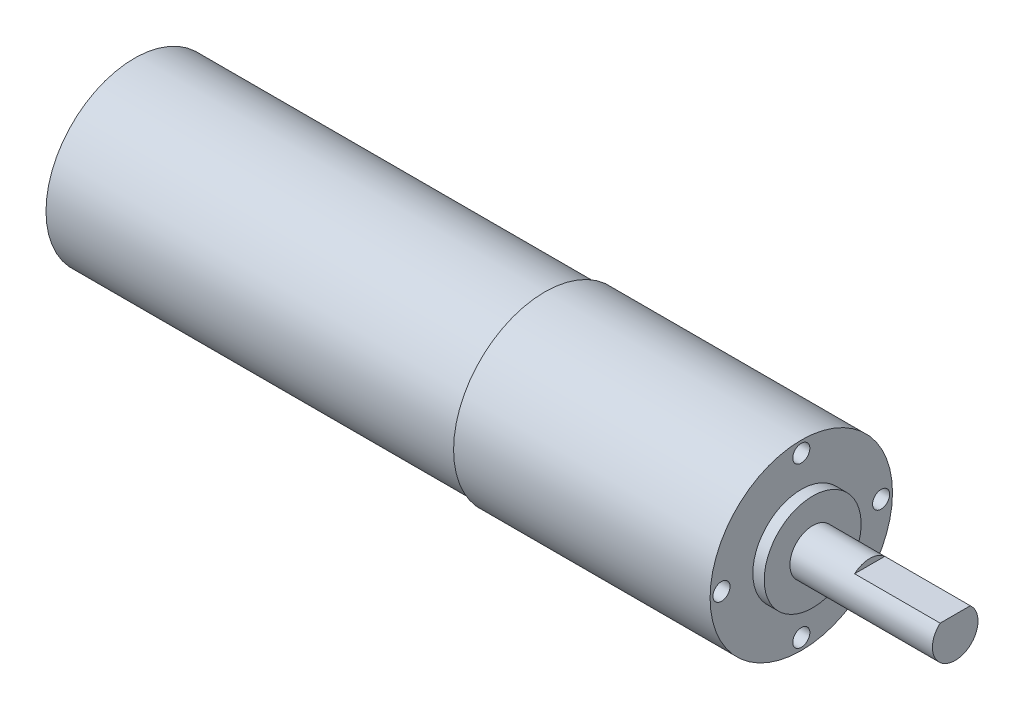
ISO-10303-21;
HEADER;
FILE_DESCRIPTION(('STEP AP214'),'2;1');
FILE_NAME('part.step','',(''),(''),'','','');
FILE_SCHEMA(('AUTOMOTIVE_DESIGN { 1 0 10303 214 1 1 1 1 }'));
ENDSEC;
DATA;
#1=APPLICATION_CONTEXT('core data for automotive mechanical design processes');
#2=APPLICATION_PROTOCOL_DEFINITION('international standard','automotive_design',2000,#1);
#3=PRODUCT_CONTEXT('',#1,'mechanical');
#4=PRODUCT('Part','Part','',(#3));
#5=PRODUCT_RELATED_PRODUCT_CATEGORY('part','',(#4));
#6=PRODUCT_DEFINITION_FORMATION('','',#4);
#7=PRODUCT_DEFINITION_CONTEXT('part definition',#1,'design');
#8=PRODUCT_DEFINITION('design','',#6,#7);
#9=PRODUCT_DEFINITION_SHAPE('','',#8);
#10=(LENGTH_UNIT() NAMED_UNIT(*) SI_UNIT(.MILLI.,.METRE.));
#11=(NAMED_UNIT(*) PLANE_ANGLE_UNIT() SI_UNIT($,.RADIAN.));
#12=(NAMED_UNIT(*) SI_UNIT($,.STERADIAN.) SOLID_ANGLE_UNIT());
#13=UNCERTAINTY_MEASURE_WITH_UNIT(LENGTH_MEASURE(1.E-05),#10,'distance_accuracy_value','');
#14=(GEOMETRIC_REPRESENTATION_CONTEXT(3) GLOBAL_UNCERTAINTY_ASSIGNED_CONTEXT((#13)) GLOBAL_UNIT_ASSIGNED_CONTEXT((#10,
#11,#12)) REPRESENTATION_CONTEXT('',''));
#15=CARTESIAN_POINT('',(0.,0.,0.));
#16=DIRECTION('',(0.,0.,1.));
#17=DIRECTION('',(1.,0.,0.));
#18=AXIS2_PLACEMENT_3D('',#15,#16,#17);
#19=CARTESIAN_POINT('',(0.,0.,0.));
#20=DIRECTION('',(1.,0.,0.));
#21=DIRECTION('',(0.,0.,-1.));
#22=AXIS2_PLACEMENT_3D('',#19,#20,#21);
#23=PLANE('',#22);
#24=CARTESIAN_POINT('',(0.,0.,0.));
#25=DIRECTION('',(-1.,0.,0.));
#26=DIRECTION('',(0.,0.,1.));
#27=AXIS2_PLACEMENT_3D('',#24,#25,#26);
#28=CIRCLE('',#27,15.5);
#29=CARTESIAN_POINT('',(0.,0.,15.5));
#30=VERTEX_POINT('',#29);
#31=EDGE_CURVE('E11',#30,#30,#28,.T.);
#32=ORIENTED_EDGE('',*,*,#31,.T.);
#33=EDGE_LOOP('',(#32));
#34=FACE_BOUND('',#33,.T.);
#35=ADVANCED_FACE('F36',(#34),#23,.F.);
#36=CARTESIAN_POINT('',(0.,0.,0.));
#37=DIRECTION('',(-1.,0.,0.));
#38=DIRECTION('',(0.,0.,1.));
#39=AXIS2_PLACEMENT_3D('',#36,#37,#38);
#40=CYLINDRICAL_SURFACE('',#39,15.5);
#41=ORIENTED_EDGE('',*,*,#31,.F.);
#42=EDGE_LOOP('',(#41));
#43=FACE_BOUND('',#42,.T.);
#44=CARTESIAN_POINT('',(72.,0.,0.));
#45=DIRECTION('',(-1.,0.,0.));
#46=DIRECTION('',(0.,0.,1.));
#47=AXIS2_PLACEMENT_3D('',#44,#45,#46);
#48=CIRCLE('',#47,15.5);
#49=CARTESIAN_POINT('',(72.,0.,15.5));
#50=VERTEX_POINT('',#49);
#51=EDGE_CURVE('E43',#50,#50,#48,.T.);
#52=ORIENTED_EDGE('',*,*,#51,.T.);
#53=EDGE_LOOP('',(#52));
#54=FACE_BOUND('',#53,.T.);
#55=ADVANCED_FACE('F96',(#43,#54),#40,.T.);
#56=CARTESIAN_POINT('',(72.,15.5,0.));
#57=DIRECTION('',(1.,0.,0.));
#58=DIRECTION('',(0.,0.,-1.));
#59=AXIS2_PLACEMENT_3D('',#56,#57,#58);
#60=PLANE('',#59);
#61=ORIENTED_EDGE('',*,*,#51,.F.);
#62=EDGE_LOOP('',(#61));
#63=FACE_BOUND('',#62,.T.);
#64=CARTESIAN_POINT('',(72.,0.,0.));
#65=DIRECTION('',(-1.,0.,0.));
#66=DIRECTION('',(0.,0.,1.));
#67=AXIS2_PLACEMENT_3D('',#64,#65,#66);
#68=CIRCLE('',#67,16.);
#69=CARTESIAN_POINT('',(72.,0.,16.));
#70=VERTEX_POINT('',#69);
#71=EDGE_CURVE('E91',#70,#70,#68,.T.);
#72=ORIENTED_EDGE('',*,*,#71,.T.);
#73=EDGE_LOOP('',(#72));
#74=FACE_BOUND('',#73,.T.);
#75=ADVANCED_FACE('F98',(#63,#74),#60,.F.);
#76=CARTESIAN_POINT('',(0.,0.,0.));
#77=DIRECTION('',(-1.,0.,0.));
#78=DIRECTION('',(0.,0.,1.));
#79=AXIS2_PLACEMENT_3D('',#76,#77,#78);
#80=CYLINDRICAL_SURFACE('',#79,16.);
#81=ORIENTED_EDGE('',*,*,#71,.F.);
#82=EDGE_LOOP('',(#81));
#83=FACE_BOUND('',#82,.T.);
#84=CARTESIAN_POINT('',(117.,0.,0.));
#85=DIRECTION('',(-1.,0.,0.));
#86=DIRECTION('',(0.,0.,1.));
#87=AXIS2_PLACEMENT_3D('',#84,#85,#86);
#88=CIRCLE('',#87,16.);
#89=CARTESIAN_POINT('',(117.,0.,16.));
#90=VERTEX_POINT('',#89);
#91=EDGE_CURVE('E88',#90,#90,#88,.T.);
#92=ORIENTED_EDGE('',*,*,#91,.T.);
#93=EDGE_LOOP('',(#92));
#94=FACE_BOUND('',#93,.T.);
#95=ADVANCED_FACE('F101',(#83,#94),#80,.T.);
#96=CARTESIAN_POINT('',(117.,16.,0.));
#97=DIRECTION('',(-1.,0.,0.));
#98=DIRECTION('',(0.,0.,1.));
#99=AXIS2_PLACEMENT_3D('',#96,#97,#98);
#100=PLANE('',#99);
#101=CARTESIAN_POINT('',(117.,14.,0.));
#102=DIRECTION('',(1.,0.,0.));
#103=DIRECTION('',(0.,0.,-1.));
#104=AXIS2_PLACEMENT_3D('',#101,#102,#103);
#105=CIRCLE('',#104,1.5);
#106=CARTESIAN_POINT('',(117.,14.,-1.5));
#107=VERTEX_POINT('',#106);
#108=EDGE_CURVE('E277',#107,#107,#105,.T.);
#109=ORIENTED_EDGE('',*,*,#108,.F.);
#110=EDGE_LOOP('',(#109));
#111=FACE_BOUND('',#110,.T.);
#112=CARTESIAN_POINT('',(117.,0.,-14.));
#113=DIRECTION('',(1.,0.,0.));
#114=DIRECTION('',(0.,0.,-1.));
#115=AXIS2_PLACEMENT_3D('',#112,#113,#114);
#116=CIRCLE('',#115,1.50000000000011);
#117=CARTESIAN_POINT('',(117.,0.,-15.5000000000001));
#118=VERTEX_POINT('',#117);
#119=EDGE_CURVE('E285',#118,#118,#116,.T.);
#120=ORIENTED_EDGE('',*,*,#119,.F.);
#121=EDGE_LOOP('',(#120));
#122=FACE_BOUND('',#121,.T.);
#123=CARTESIAN_POINT('',(117.,-14.,0.));
#124=DIRECTION('',(1.,0.,0.));
#125=DIRECTION('',(0.,0.,-1.));
#126=AXIS2_PLACEMENT_3D('',#123,#124,#125);
#127=CIRCLE('',#126,1.50000000000049);
#128=CARTESIAN_POINT('',(117.,-14.,-1.5000000000005));
#129=VERTEX_POINT('',#128);
#130=EDGE_CURVE('E291',#129,#129,#127,.T.);
#131=ORIENTED_EDGE('',*,*,#130,.F.);
#132=EDGE_LOOP('',(#131));
#133=FACE_BOUND('',#132,.T.);
#134=CARTESIAN_POINT('',(117.,0.,14.));
#135=DIRECTION('',(1.,0.,0.));
#136=DIRECTION('',(0.,0.,-1.));
#137=AXIS2_PLACEMENT_3D('',#134,#135,#136);
#138=CIRCLE('',#137,1.50000000000038);
#139=CARTESIAN_POINT('',(117.,0.,12.4999999999996));
#140=VERTEX_POINT('',#139);
#141=EDGE_CURVE('E297',#140,#140,#138,.T.);
#142=ORIENTED_EDGE('',*,*,#141,.F.);
#143=EDGE_LOOP('',(#142));
#144=FACE_BOUND('',#143,.T.);
#145=ORIENTED_EDGE('',*,*,#91,.F.);
#146=EDGE_LOOP('',(#145));
#147=FACE_BOUND('',#146,.T.);
#148=CARTESIAN_POINT('',(117.,0.,0.));
#149=DIRECTION('',(-1.,0.,0.));
#150=DIRECTION('',(0.,0.,1.));
#151=AXIS2_PLACEMENT_3D('',#148,#149,#150);
#152=CIRCLE('',#151,8.5);
#153=CARTESIAN_POINT('',(117.,0.,8.5));
#154=VERTEX_POINT('',#153);
#155=EDGE_CURVE('E85',#154,#154,#152,.T.);
#156=ORIENTED_EDGE('',*,*,#155,.T.);
#157=EDGE_LOOP('',(#156));
#158=FACE_BOUND('',#157,.T.);
#159=ADVANCED_FACE('F107',(#111,#122,#133,#144,#147,#158),#100,.F.);
#160=CARTESIAN_POINT('',(0.,0.,0.));
#161=DIRECTION('',(-1.,0.,0.));
#162=DIRECTION('',(0.,0.,1.));
#163=AXIS2_PLACEMENT_3D('',#160,#161,#162);
#164=CYLINDRICAL_SURFACE('',#163,8.5);
#165=ORIENTED_EDGE('',*,*,#155,.F.);
#166=EDGE_LOOP('',(#165));
#167=FACE_BOUND('',#166,.T.);
#168=CARTESIAN_POINT('',(119.,0.,0.));
#169=DIRECTION('',(-1.,0.,0.));
#170=DIRECTION('',(0.,0.,1.));
#171=AXIS2_PLACEMENT_3D('',#168,#169,#170);
#172=CIRCLE('',#171,8.5);
#173=CARTESIAN_POINT('',(119.,0.,8.5));
#174=VERTEX_POINT('',#173);
#175=EDGE_CURVE('E79',#174,#174,#172,.T.);
#176=ORIENTED_EDGE('',*,*,#175,.T.);
#177=EDGE_LOOP('',(#176));
#178=FACE_BOUND('',#177,.T.);
#179=ADVANCED_FACE('F113',(#167,#178),#164,.T.);
#180=CARTESIAN_POINT('',(119.,8.5,0.));
#181=DIRECTION('',(-1.,0.,0.));
#182=DIRECTION('',(0.,0.,1.));
#183=AXIS2_PLACEMENT_3D('',#180,#181,#182);
#184=PLANE('',#183);
#185=ORIENTED_EDGE('',*,*,#175,.F.);
#186=EDGE_LOOP('',(#185));
#187=FACE_BOUND('',#186,.T.);
#188=CARTESIAN_POINT('',(119.,0.,0.));
#189=DIRECTION('',(-1.,0.,0.));
#190=DIRECTION('',(0.,0.,1.));
#191=AXIS2_PLACEMENT_3D('',#188,#189,#190);
#192=CIRCLE('',#191,4.);
#193=CARTESIAN_POINT('',(119.,0.,4.));
#194=VERTEX_POINT('',#193);
#195=EDGE_CURVE('E76',#194,#194,#192,.T.);
#196=ORIENTED_EDGE('',*,*,#195,.T.);
#197=EDGE_LOOP('',(#196));
#198=FACE_BOUND('',#197,.T.);
#199=ADVANCED_FACE('F120',(#187,#198),#184,.F.);
#200=CARTESIAN_POINT('',(0.,0.,0.));
#201=DIRECTION('',(-1.,0.,0.));
#202=DIRECTION('',(0.,0.,1.));
#203=AXIS2_PLACEMENT_3D('',#200,#201,#202);
#204=CYLINDRICAL_SURFACE('',#203,4.);
#205=CARTESIAN_POINT('',(144.,0.,0.));
#206=DIRECTION('',(-1.,0.,0.));
#207=DIRECTION('',(0.,0.,1.));
#208=AXIS2_PLACEMENT_3D('',#205,#206,#207);
#209=CIRCLE('',#208,4.);
#210=CARTESIAN_POINT('',(144.,3.,-2.64575131106459));
#211=VERTEX_POINT('',#210);
#212=CARTESIAN_POINT('',(144.,3.,2.64575131106459));
#213=VERTEX_POINT('',#212);
#214=EDGE_CURVE('E73',#211,#213,#209,.T.);
#215=ORIENTED_EDGE('',*,*,#214,.T.);
#216=DIRECTION('',(1.,0.,0.));
#217=VECTOR('',#216,1.);
#218=CARTESIAN_POINT('',(129.,3.,2.64575131106459));
#219=LINE('',#218,#217);
#220=CARTESIAN_POINT('',(129.,3.,2.64575131106459));
#221=VERTEX_POINT('',#220);
#222=EDGE_CURVE('E50',#221,#213,#219,.T.);
#223=ORIENTED_EDGE('',*,*,#222,.F.);
#224=CARTESIAN_POINT('',(129.,0.,0.));
#225=DIRECTION('',(1.,0.,0.));
#226=DIRECTION('',(0.,0.,-1.));
#227=AXIS2_PLACEMENT_3D('',#224,#225,#226);
#228=CIRCLE('',#227,4.);
#229=CARTESIAN_POINT('',(129.,3.,-2.64575131106459));
#230=VERTEX_POINT('',#229);
#231=EDGE_CURVE('E66',#230,#221,#228,.T.);
#232=ORIENTED_EDGE('',*,*,#231,.F.);
#233=DIRECTION('',(1.,0.,0.));
#234=VECTOR('',#233,1.);
#235=CARTESIAN_POINT('',(129.,3.,-2.64575131106459));
#236=LINE('',#235,#234);
#237=EDGE_CURVE('E56',#230,#211,#236,.T.);
#238=ORIENTED_EDGE('',*,*,#237,.T.);
#239=EDGE_LOOP('',(#215,#223,#232,#238));
#240=FACE_BOUND('',#239,.T.);
#241=ORIENTED_EDGE('',*,*,#195,.F.);
#242=EDGE_LOOP('',(#241));
#243=FACE_BOUND('',#242,.T.);
#244=ADVANCED_FACE('F71',(#240,#243),#204,.T.);
#245=CARTESIAN_POINT('',(144.,4.,0.));
#246=DIRECTION('',(-1.,0.,0.));
#247=DIRECTION('',(0.,0.,1.));
#248=AXIS2_PLACEMENT_3D('',#245,#246,#247);
#249=PLANE('',#248);
#250=ORIENTED_EDGE('',*,*,#214,.F.);
#251=DIRECTION('',(0.,0.,-1.));
#252=VECTOR('',#251,1.);
#253=CARTESIAN_POINT('',(144.,3.,2.64575131106459));
#254=LINE('',#253,#252);
#255=EDGE_CURVE('E61',#213,#211,#254,.T.);
#256=ORIENTED_EDGE('',*,*,#255,.F.);
#257=EDGE_LOOP('',(#250,#256));
#258=FACE_BOUND('',#257,.T.);
#259=ADVANCED_FACE('F75',(#258),#249,.F.);
#260=CARTESIAN_POINT('',(129.,3.,2.64575131106459));
#261=DIRECTION('',(0.,-1.,0.));
#262=DIRECTION('',(0.,0.,-1.));
#263=AXIS2_PLACEMENT_3D('',#260,#261,#262);
#264=PLANE('',#263);
#265=ORIENTED_EDGE('',*,*,#255,.T.);
#266=ORIENTED_EDGE('',*,*,#237,.F.);
#267=DIRECTION('',(0.,0.,-1.));
#268=VECTOR('',#267,1.);
#269=CARTESIAN_POINT('',(129.,3.,2.64575131106459));
#270=LINE('',#269,#268);
#271=EDGE_CURVE('E301',#221,#230,#270,.T.);
#272=ORIENTED_EDGE('',*,*,#271,.F.);
#273=ORIENTED_EDGE('',*,*,#222,.T.);
#274=EDGE_LOOP('',(#265,#266,#272,#273));
#275=FACE_BOUND('',#274,.T.);
#276=ADVANCED_FACE('F62',(#275),#264,.F.);
#277=CARTESIAN_POINT('',(129.,0.,0.));
#278=DIRECTION('',(1.,0.,0.));
#279=DIRECTION('',(0.,0.,-1.));
#280=AXIS2_PLACEMENT_3D('',#277,#278,#279);
#281=PLANE('',#280);
#282=ORIENTED_EDGE('',*,*,#231,.T.);
#283=ORIENTED_EDGE('',*,*,#271,.T.);
#284=EDGE_LOOP('',(#282,#283));
#285=FACE_BOUND('',#284,.T.);
#286=ADVANCED_FACE('F183',(#285),#281,.T.);
#287=CARTESIAN_POINT('',(112.,0.,14.));
#288=DIRECTION('',(1.,0.,0.));
#289=DIRECTION('',(0.,0.,-1.));
#290=AXIS2_PLACEMENT_3D('',#287,#288,#289);
#291=CYLINDRICAL_SURFACE('',#290,1.50000000000038);
#292=CARTESIAN_POINT('',(112.,0.,14.));
#293=DIRECTION('',(1.,0.,0.));
#294=DIRECTION('',(0.,0.,-1.));
#295=AXIS2_PLACEMENT_3D('',#292,#293,#294);
#296=CIRCLE('',#295,1.50000000000038);
#297=CARTESIAN_POINT('',(112.,0.,12.4999999999996));
#298=VERTEX_POINT('',#297);
#299=EDGE_CURVE('E294',#298,#298,#296,.T.);
#300=ORIENTED_EDGE('',*,*,#299,.F.);
#301=EDGE_LOOP('',(#300));
#302=FACE_BOUND('',#301,.T.);
#303=ORIENTED_EDGE('',*,*,#141,.T.);
#304=EDGE_LOOP('',(#303));
#305=FACE_BOUND('',#304,.T.);
#306=ADVANCED_FACE('F191',(#302,#305),#291,.F.);
#307=CARTESIAN_POINT('',(112.,0.,14.));
#308=DIRECTION('',(1.,0.,0.));
#309=DIRECTION('',(0.,0.,-1.));
#310=AXIS2_PLACEMENT_3D('',#307,#308,#309);
#311=PLANE('',#310);
#312=ORIENTED_EDGE('',*,*,#299,.T.);
#313=EDGE_LOOP('',(#312));
#314=FACE_BOUND('',#313,.T.);
#315=ADVANCED_FACE('F201',(#314),#311,.T.);
#316=CARTESIAN_POINT('',(112.,-14.,0.));
#317=DIRECTION('',(1.,0.,0.));
#318=DIRECTION('',(0.,0.,-1.));
#319=AXIS2_PLACEMENT_3D('',#316,#317,#318);
#320=CYLINDRICAL_SURFACE('',#319,1.50000000000049);
#321=CARTESIAN_POINT('',(112.,-14.,0.));
#322=DIRECTION('',(1.,0.,0.));
#323=DIRECTION('',(0.,0.,-1.));
#324=AXIS2_PLACEMENT_3D('',#321,#322,#323);
#325=CIRCLE('',#324,1.50000000000049);
#326=CARTESIAN_POINT('',(112.,-14.,-1.5000000000005));
#327=VERTEX_POINT('',#326);
#328=EDGE_CURVE('E288',#327,#327,#325,.T.);
#329=ORIENTED_EDGE('',*,*,#328,.F.);
#330=EDGE_LOOP('',(#329));
#331=FACE_BOUND('',#330,.T.);
#332=ORIENTED_EDGE('',*,*,#130,.T.);
#333=EDGE_LOOP('',(#332));
#334=FACE_BOUND('',#333,.T.);
#335=ADVANCED_FACE('F208',(#331,#334),#320,.F.);
#336=CARTESIAN_POINT('',(112.,-14.,0.));
#337=DIRECTION('',(1.,0.,0.));
#338=DIRECTION('',(0.,0.,-1.));
#339=AXIS2_PLACEMENT_3D('',#336,#337,#338);
#340=PLANE('',#339);
#341=ORIENTED_EDGE('',*,*,#328,.T.);
#342=EDGE_LOOP('',(#341));
#343=FACE_BOUND('',#342,.T.);
#344=ADVANCED_FACE('F216',(#343),#340,.T.);
#345=CARTESIAN_POINT('',(112.,0.,-14.));
#346=DIRECTION('',(1.,0.,0.));
#347=DIRECTION('',(0.,0.,-1.));
#348=AXIS2_PLACEMENT_3D('',#345,#346,#347);
#349=CYLINDRICAL_SURFACE('',#348,1.50000000000011);
#350=CARTESIAN_POINT('',(112.,0.,-14.));
#351=DIRECTION('',(1.,0.,0.));
#352=DIRECTION('',(0.,0.,-1.));
#353=AXIS2_PLACEMENT_3D('',#350,#351,#352);
#354=CIRCLE('',#353,1.50000000000011);
#355=CARTESIAN_POINT('',(112.,0.,-15.5000000000001));
#356=VERTEX_POINT('',#355);
#357=EDGE_CURVE('E280',#356,#356,#354,.T.);
#358=ORIENTED_EDGE('',*,*,#357,.F.);
#359=EDGE_LOOP('',(#358));
#360=FACE_BOUND('',#359,.T.);
#361=ORIENTED_EDGE('',*,*,#119,.T.);
#362=EDGE_LOOP('',(#361));
#363=FACE_BOUND('',#362,.T.);
#364=ADVANCED_FACE('F224',(#360,#363),#349,.F.);
#365=CARTESIAN_POINT('',(112.,0.,-14.));
#366=DIRECTION('',(1.,0.,0.));
#367=DIRECTION('',(0.,0.,-1.));
#368=AXIS2_PLACEMENT_3D('',#365,#366,#367);
#369=PLANE('',#368);
#370=ORIENTED_EDGE('',*,*,#357,.T.);
#371=EDGE_LOOP('',(#370));
#372=FACE_BOUND('',#371,.T.);
#373=ADVANCED_FACE('F232',(#372),#369,.T.);
#374=CARTESIAN_POINT('',(112.,14.,0.));
#375=DIRECTION('',(1.,0.,0.));
#376=DIRECTION('',(0.,0.,-1.));
#377=AXIS2_PLACEMENT_3D('',#374,#375,#376);
#378=CYLINDRICAL_SURFACE('',#377,1.5);
#379=CARTESIAN_POINT('',(112.,14.,0.));
#380=DIRECTION('',(1.,0.,0.));
#381=DIRECTION('',(0.,0.,-1.));
#382=AXIS2_PLACEMENT_3D('',#379,#380,#381);
#383=CIRCLE('',#382,1.5);
#384=CARTESIAN_POINT('',(112.,14.,-1.5));
#385=VERTEX_POINT('',#384);
#386=EDGE_CURVE('E67',#385,#385,#383,.T.);
#387=ORIENTED_EDGE('',*,*,#386,.F.);
#388=EDGE_LOOP('',(#387));
#389=FACE_BOUND('',#388,.T.);
#390=ORIENTED_EDGE('',*,*,#108,.T.);
#391=EDGE_LOOP('',(#390));
#392=FACE_BOUND('',#391,.T.);
#393=ADVANCED_FACE('F240',(#389,#392),#378,.F.);
#394=CARTESIAN_POINT('',(112.,14.,0.));
#395=DIRECTION('',(1.,0.,0.));
#396=DIRECTION('',(0.,0.,-1.));
#397=AXIS2_PLACEMENT_3D('',#394,#395,#396);
#398=PLANE('',#397);
#399=ORIENTED_EDGE('',*,*,#386,.T.);
#400=EDGE_LOOP('',(#399));
#401=FACE_BOUND('',#400,.T.);
#402=ADVANCED_FACE('F248',(#401),#398,.T.);
#403=CLOSED_SHELL('',(#35,#55,#75,#95,#159,#179,#199,#244,#259,#276,#286,#306,#315,#335,#344,
#364,#373,#393,#402));
#404=MANIFOLD_SOLID_BREP('B2',#403);
#405=ADVANCED_BREP_SHAPE_REPRESENTATION('',(#18,#404),#14);
#406=SHAPE_DEFINITION_REPRESENTATION(#9,#405);
ENDSEC;
END-ISO-10303-21;
